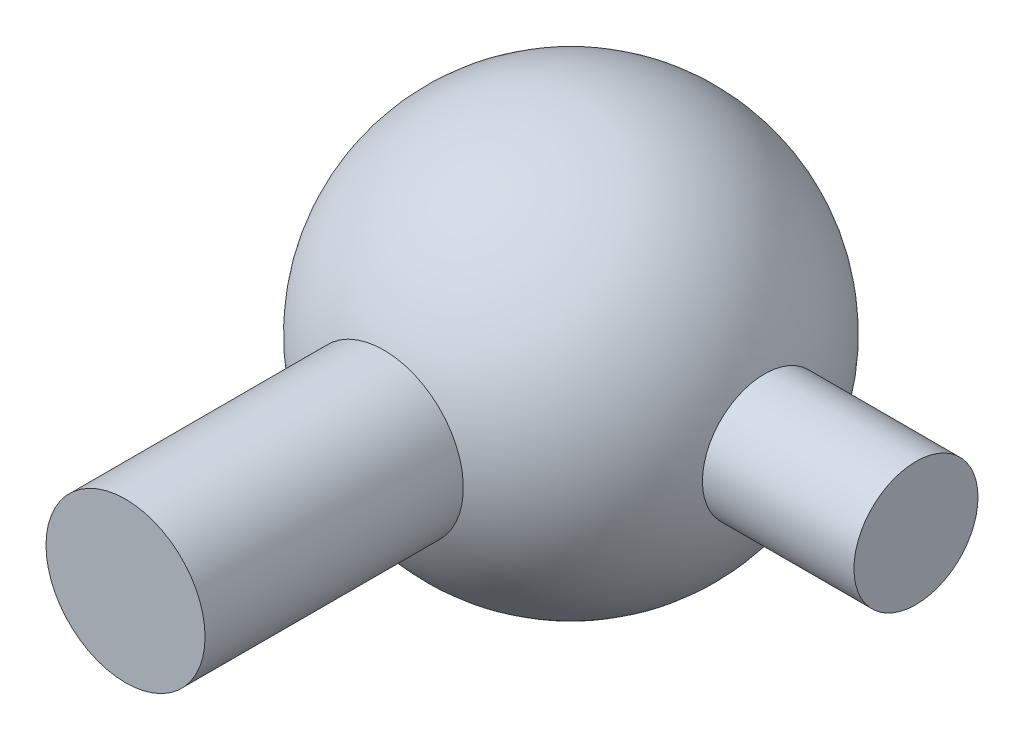
ISO-10303-21;
HEADER;
FILE_DESCRIPTION(('STEP AP214'),'2;1');
FILE_NAME('part.step','',(''),(''),'','','');
FILE_SCHEMA(('AUTOMOTIVE_DESIGN { 1 0 10303 214 1 1 1 1 }'));
ENDSEC;
DATA;
#1=APPLICATION_CONTEXT('core data for automotive mechanical design processes');
#2=APPLICATION_PROTOCOL_DEFINITION('international standard','automotive_design',2000,#1);
#3=PRODUCT_CONTEXT('',#1,'mechanical');
#4=PRODUCT('Part','Part','',(#3));
#5=PRODUCT_RELATED_PRODUCT_CATEGORY('part','',(#4));
#6=PRODUCT_DEFINITION_FORMATION('','',#4);
#7=PRODUCT_DEFINITION_CONTEXT('part definition',#1,'design');
#8=PRODUCT_DEFINITION('design','',#6,#7);
#9=PRODUCT_DEFINITION_SHAPE('','',#8);
#10=(LENGTH_UNIT() NAMED_UNIT(*) SI_UNIT(.MILLI.,.METRE.));
#11=(NAMED_UNIT(*) PLANE_ANGLE_UNIT() SI_UNIT($,.RADIAN.));
#12=(NAMED_UNIT(*) SI_UNIT($,.STERADIAN.) SOLID_ANGLE_UNIT());
#13=UNCERTAINTY_MEASURE_WITH_UNIT(LENGTH_MEASURE(1.E-05),#10,'distance_accuracy_value','');
#14=(GEOMETRIC_REPRESENTATION_CONTEXT(3) GLOBAL_UNCERTAINTY_ASSIGNED_CONTEXT((#13)) GLOBAL_UNIT_ASSIGNED_CONTEXT((#10,
#11,#12)) REPRESENTATION_CONTEXT('',''));
#15=CARTESIAN_POINT('',(0.,0.,0.));
#16=DIRECTION('',(0.,0.,1.));
#17=DIRECTION('',(1.,0.,0.));
#18=AXIS2_PLACEMENT_3D('',#15,#16,#17);
#19=CARTESIAN_POINT('',(0.,0.,0.));
#20=DIRECTION('',(0.,-1.,0.));
#21=DIRECTION('',(-1.,0.,0.));
#22=AXIS2_PLACEMENT_3D('',#19,#20,#21);
#23=SPHERICAL_SURFACE('',#22,6.38989884326073);
#24=CARTESIAN_POINT('',(0.,0.,5.88054480699746));
#25=DIRECTION('',(0.,0.,-1.));
#26=DIRECTION('',(-1.,0.,0.));
#27=AXIS2_PLACEMENT_3D('',#24,#25,#26);
#28=CIRCLE('',#27,2.5);
#29=CARTESIAN_POINT('',(-2.5,0.,5.88054480699746));
#30=VERTEX_POINT('',#29);
#31=EDGE_CURVE('E35',#30,#30,#28,.F.);
#32=ORIENTED_EDGE('',*,*,#31,.F.);
#33=EDGE_LOOP('',(#32));
#34=FACE_BOUND('',#33,.T.);
#35=CARTESIAN_POINT('',(6.08508892515999,0.,0.));
#36=DIRECTION('',(-1.,0.,0.));
#37=DIRECTION('',(0.,0.,1.));
#38=AXIS2_PLACEMENT_3D('',#35,#36,#37);
#39=CIRCLE('',#38,1.95);
#40=CARTESIAN_POINT('',(6.08508892515999,0.,1.95));
#41=VERTEX_POINT('',#40);
#42=EDGE_CURVE('E10',#41,#41,#39,.F.);
#43=ORIENTED_EDGE('',*,*,#42,.F.);
#44=EDGE_LOOP('',(#43));
#45=FACE_BOUND('',#44,.T.);
#46=ADVANCED_FACE('F29',(#34,#45),#23,.T.);
#47=CARTESIAN_POINT('',(0.,0.,14.));
#48=DIRECTION('',(0.,0.,-1.));
#49=DIRECTION('',(-1.,0.,0.));
#50=AXIS2_PLACEMENT_3D('',#47,#48,#49);
#51=CYLINDRICAL_SURFACE('',#50,2.5);
#52=CARTESIAN_POINT('',(0.,0.,14.));
#53=DIRECTION('',(0.,0.,1.));
#54=DIRECTION('',(1.,0.,0.));
#55=AXIS2_PLACEMENT_3D('',#52,#53,#54);
#56=CIRCLE('',#55,2.5);
#57=CARTESIAN_POINT('',(2.5,0.,14.));
#58=VERTEX_POINT('',#57);
#59=EDGE_CURVE('E39',#58,#58,#56,.T.);
#60=ORIENTED_EDGE('',*,*,#59,.F.);
#61=EDGE_LOOP('',(#60));
#62=FACE_BOUND('',#61,.T.);
#63=ORIENTED_EDGE('',*,*,#31,.T.);
#64=EDGE_LOOP('',(#63));
#65=FACE_BOUND('',#64,.T.);
#66=ADVANCED_FACE('F61',(#62,#65),#51,.T.);
#67=CARTESIAN_POINT('',(0.,0.,14.));
#68=DIRECTION('',(0.,0.,1.));
#69=DIRECTION('',(1.,0.,0.));
#70=AXIS2_PLACEMENT_3D('',#67,#68,#69);
#71=PLANE('',#70);
#72=ORIENTED_EDGE('',*,*,#59,.T.);
#73=EDGE_LOOP('',(#72));
#74=FACE_BOUND('',#73,.T.);
#75=ADVANCED_FACE('F53',(#74),#71,.T.);
#76=CARTESIAN_POINT('',(10.8470999501165,0.,0.));
#77=DIRECTION('',(-1.,0.,0.));
#78=DIRECTION('',(0.,0.,1.));
#79=AXIS2_PLACEMENT_3D('',#76,#77,#78);
#80=CYLINDRICAL_SURFACE('',#79,1.95);
#81=CARTESIAN_POINT('',(10.8470999501165,0.,0.));
#82=DIRECTION('',(1.,0.,0.));
#83=DIRECTION('',(0.,0.,-1.));
#84=AXIS2_PLACEMENT_3D('',#81,#82,#83);
#85=CIRCLE('',#84,1.95);
#86=CARTESIAN_POINT('',(10.8470999501165,0.,-1.95));
#87=VERTEX_POINT('',#86);
#88=EDGE_CURVE('E43',#87,#87,#85,.T.);
#89=ORIENTED_EDGE('',*,*,#88,.F.);
#90=EDGE_LOOP('',(#89));
#91=FACE_BOUND('',#90,.T.);
#92=ORIENTED_EDGE('',*,*,#42,.T.);
#93=EDGE_LOOP('',(#92));
#94=FACE_BOUND('',#93,.T.);
#95=ADVANCED_FACE('F51',(#91,#94),#80,.T.);
#96=CARTESIAN_POINT('',(10.8470999501165,0.,0.));
#97=DIRECTION('',(1.,0.,0.));
#98=DIRECTION('',(0.,0.,-1.));
#99=AXIS2_PLACEMENT_3D('',#96,#97,#98);
#100=PLANE('',#99);
#101=ORIENTED_EDGE('',*,*,#88,.T.);
#102=EDGE_LOOP('',(#101));
#103=FACE_BOUND('',#102,.T.);
#104=ADVANCED_FACE('F49',(#103),#100,.T.);
#105=CLOSED_SHELL('',(#46,#66,#75,#95,#104));
#106=MANIFOLD_SOLID_BREP('B2',#105);
#107=ADVANCED_BREP_SHAPE_REPRESENTATION('',(#18,#106),#14);
#108=SHAPE_DEFINITION_REPRESENTATION(#9,#107);
ENDSEC;
END-ISO-10303-21;
